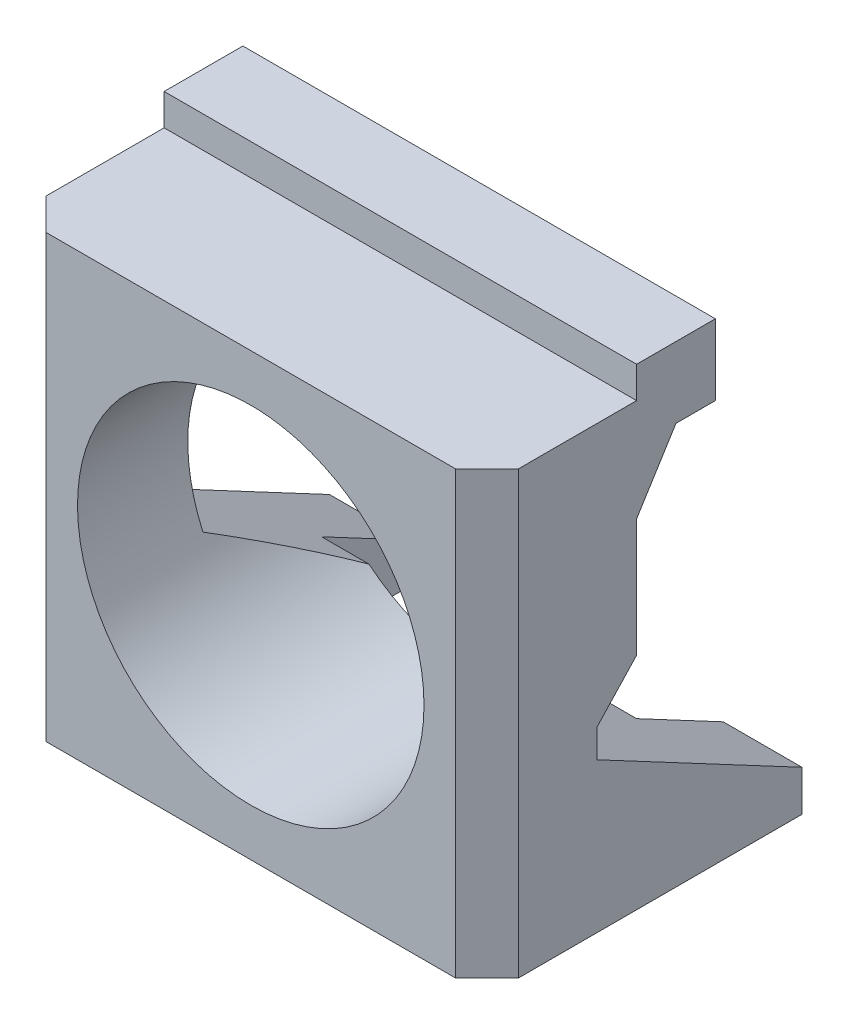
ISO-10303-21;
HEADER;
FILE_DESCRIPTION(('STEP AP214'),'2;1');
FILE_NAME('part.step','',(''),(''),'','','');
FILE_SCHEMA(('AUTOMOTIVE_DESIGN { 1 0 10303 214 1 1 1 1 }'));
ENDSEC;
DATA;
#1=APPLICATION_CONTEXT('core data for automotive mechanical design processes');
#2=APPLICATION_PROTOCOL_DEFINITION('international standard','automotive_design',2000,#1);
#3=PRODUCT_CONTEXT('',#1,'mechanical');
#4=PRODUCT('Part','Part','',(#3));
#5=PRODUCT_RELATED_PRODUCT_CATEGORY('part','',(#4));
#6=PRODUCT_DEFINITION_FORMATION('','',#4);
#7=PRODUCT_DEFINITION_CONTEXT('part definition',#1,'design');
#8=PRODUCT_DEFINITION('design','',#6,#7);
#9=PRODUCT_DEFINITION_SHAPE('','',#8);
#10=(LENGTH_UNIT() NAMED_UNIT(*) SI_UNIT(.MILLI.,.METRE.));
#11=(NAMED_UNIT(*) PLANE_ANGLE_UNIT() SI_UNIT($,.RADIAN.));
#12=(NAMED_UNIT(*) SI_UNIT($,.STERADIAN.) SOLID_ANGLE_UNIT());
#13=UNCERTAINTY_MEASURE_WITH_UNIT(LENGTH_MEASURE(1.E-05),#10,'distance_accuracy_value','');
#14=(GEOMETRIC_REPRESENTATION_CONTEXT(3) GLOBAL_UNCERTAINTY_ASSIGNED_CONTEXT((#13)) GLOBAL_UNIT_ASSIGNED_CONTEXT((#10,
#11,#12)) REPRESENTATION_CONTEXT('',''));
#15=CARTESIAN_POINT('',(0.,0.,0.));
#16=DIRECTION('',(0.,0.,1.));
#17=DIRECTION('',(1.,0.,0.));
#18=AXIS2_PLACEMENT_3D('',#15,#16,#17);
#19=CARTESIAN_POINT('',(0.,0.,-2.5));
#20=DIRECTION('',(0.,0.,1.));
#21=DIRECTION('',(1.,0.,0.));
#22=AXIS2_PLACEMENT_3D('',#19,#20,#21);
#23=PLANE('',#22);
#24=DIRECTION('',(-0.93374611730205,0.357936011632452,0.));
#25=VECTOR('',#24,1.);
#26=CARTESIAN_POINT('',(15.,0.,-2.5));
#27=LINE('',#26,#25);
#28=CARTESIAN_POINT('',(10.8863875755528,1.57688476270478,-2.5));
#29=VERTEX_POINT('',#28);
#30=CARTESIAN_POINT('',(-4.56303568016695,7.49916367739733,-2.5));
#31=VERTEX_POINT('',#30);
#32=EDGE_CURVE('E77',#29,#31,#27,.T.);
#33=ORIENTED_EDGE('',*,*,#32,.T.);
#34=DIRECTION('',(1.,0.,0.));
#35=VECTOR('',#34,1.);
#36=CARTESIAN_POINT('',(15.,7.49916367739733,-2.5));
#37=LINE('',#36,#35);
#38=CARTESIAN_POINT('',(15.,7.49916367739733,-2.5));
#39=VERTEX_POINT('',#38);
#40=EDGE_CURVE('E416',#31,#39,#37,.T.);
#41=ORIENTED_EDGE('',*,*,#40,.T.);
#42=DIRECTION('',(0.,-1.,0.));
#43=VECTOR('',#42,1.);
#44=CARTESIAN_POINT('',(15.,14.,-2.5));
#45=LINE('',#44,#43);
#46=CARTESIAN_POINT('',(15.,0.,-2.5));
#47=VERTEX_POINT('',#46);
#48=EDGE_CURVE('E281',#39,#47,#45,.T.);
#49=ORIENTED_EDGE('',*,*,#48,.T.);
#50=EDGE_CURVE('E283',#47,#29,#27,.T.);
#51=ORIENTED_EDGE('',*,*,#50,.T.);
#52=EDGE_LOOP('',(#33,#41,#49,#51));
#53=FACE_BOUND('',#52,.T.);
#54=ADVANCED_FACE('F61',(#53),#23,.F.);
#55=CARTESIAN_POINT('',(-15.,-11.5,-13.1650852574246));
#56=DIRECTION('',(0.,0.882947592858929,-0.469471562785888));
#57=DIRECTION('',(-1.,0.,0.));
#58=AXIS2_PLACEMENT_3D('',#55,#56,#57);
#59=PLANE('',#58);
#60=DIRECTION('',(-1.,0.,0.));
#61=VECTOR('',#60,1.);
#62=CARTESIAN_POINT('',(-15.,-8.48782073746096,-7.5));
#63=LINE('',#62,#61);
#64=CARTESIAN_POINT('',(6.99692068904083,-8.48782073746097,-7.50000000000001));
#65=VERTEX_POINT('',#64);
#66=CARTESIAN_POINT('',(10.,-8.48782073746097,-7.50000000000001));
#67=VERTEX_POINT('',#66);
#68=EDGE_CURVE('E397',#65,#67,#63,.F.);
#69=ORIENTED_EDGE('',*,*,#68,.F.);
#70=CARTESIAN_POINT('',(0.,0.,8.46326909405839));
#71=DIRECTION('',(0.,0.882947592858929,-0.469471562785888));
#72=DIRECTION('',(0.,-0.469471562785888,-0.882947592858929));
#73=AXIS2_PLACEMENT_3D('',#70,#71,#72);
#74=ELLIPSE('',#73,23.4305991500848,11.);
#75=CARTESIAN_POINT('',(10.0374299499424,-4.49999999999991,0.));
#76=VERTEX_POINT('',#75);
#77=EDGE_CURVE('E408',#76,#65,#74,.T.);
#78=ORIENTED_EDGE('',*,*,#77,.F.);
#79=DIRECTION('',(-1.,0.,0.));
#80=VECTOR('',#79,1.);
#81=CARTESIAN_POINT('',(-15.,-4.49999999999991,0.));
#82=LINE('',#81,#80);
#83=CARTESIAN_POINT('',(15.,-4.4999999999999,0.));
#84=VERTEX_POINT('',#83);
#85=EDGE_CURVE('E387',#84,#76,#82,.T.);
#86=ORIENTED_EDGE('',*,*,#85,.F.);
#87=DIRECTION('',(0.,-0.469471562785888,-0.882947592858929));
#88=VECTOR('',#87,1.);
#89=CARTESIAN_POINT('',(15.,2.47909714683824,13.1257727082817));
#90=LINE('',#89,#88);
#91=CARTESIAN_POINT('',(15.,-11.4122226115991,-13.));
#92=VERTEX_POINT('',#91);
#93=EDGE_CURVE('E406',#92,#84,#90,.F.);
#94=ORIENTED_EDGE('',*,*,#93,.F.);
#95=DIRECTION('',(-1.,0.,0.));
#96=VECTOR('',#95,1.);
#97=CARTESIAN_POINT('',(-15.,-11.4122226115991,-13.));
#98=LINE('',#97,#96);
#99=CARTESIAN_POINT('',(10.,-11.4122226115991,-13.));
#100=VERTEX_POINT('',#99);
#101=EDGE_CURVE('E403',#100,#92,#98,.F.);
#102=ORIENTED_EDGE('',*,*,#101,.F.);
#103=DIRECTION('',(0.,0.469471562785888,0.882947592858929));
#104=VECTOR('',#103,1.);
#105=CARTESIAN_POINT('',(10.,-11.9825779301216,-14.0726823421964));
#106=LINE('',#105,#104);
#107=EDGE_CURVE('E400',#67,#100,#106,.F.);
#108=ORIENTED_EDGE('',*,*,#107,.F.);
#109=EDGE_LOOP('',(#69,#78,#86,#94,#102,#108));
#110=FACE_BOUND('',#109,.T.);
#111=ADVANCED_FACE('F457',(#110),#59,.T.);
#112=CARTESIAN_POINT('',(0.,0.,0.));
#113=DIRECTION('',(0.,0.,1.));
#114=DIRECTION('',(1.,0.,0.));
#115=AXIS2_PLACEMENT_3D('',#112,#113,#114);
#116=PLANE('',#115);
#117=DIRECTION('',(0.,1.,0.));
#118=VECTOR('',#117,1.);
#119=CARTESIAN_POINT('',(15.,14.,0.));
#120=LINE('',#119,#118);
#121=CARTESIAN_POINT('',(15.,-2.67738730440289,0.));
#122=VERTEX_POINT('',#121);
#123=EDGE_CURVE('E322',#84,#122,#120,.T.);
#124=ORIENTED_EDGE('',*,*,#123,.F.);
#125=ORIENTED_EDGE('',*,*,#85,.T.);
#126=CARTESIAN_POINT('',(0.,0.,0.));
#127=DIRECTION('',(0.,0.,1.));
#128=DIRECTION('',(1.,0.,0.));
#129=AXIS2_PLACEMENT_3D('',#126,#127,#128);
#130=CIRCLE('',#129,11.);
#131=CARTESIAN_POINT('',(10.9426223168165,-1.12205919251589,0.));
#132=VERTEX_POINT('',#131);
#133=EDGE_CURVE('E310',#76,#132,#130,.T.);
#134=ORIENTED_EDGE('',*,*,#133,.T.);
#135=DIRECTION('',(0.93374611730205,-0.357936011632452,0.));
#136=VECTOR('',#135,1.);
#137=CARTESIAN_POINT('',(14.1051599709189,-2.33436529325513,0.));
#138=LINE('',#137,#136);
#139=EDGE_CURVE('E371',#132,#122,#138,.T.);
#140=ORIENTED_EDGE('',*,*,#139,.T.);
#141=EDGE_LOOP('',(#124,#125,#134,#140));
#142=FACE_BOUND('',#141,.T.);
#143=ADVANCED_FACE('F463',(#142),#116,.F.);
#144=CARTESIAN_POINT('',(-8.88875672227835,6.47996943913715,0.));
#145=VERTEX_POINT('',#144);
#146=CARTESIAN_POINT('',(-10.0374299499424,-4.49999999999991,0.));
#147=VERTEX_POINT('',#146);
#148=EDGE_CURVE('E326',#145,#147,#130,.T.);
#149=ORIENTED_EDGE('',*,*,#148,.T.);
#150=DIRECTION('',(-1.,0.,0.));
#151=VECTOR('',#150,1.);
#152=CARTESIAN_POINT('',(-15.,-4.49999999999991,0.));
#153=LINE('',#152,#151);
#154=CARTESIAN_POINT('',(-15.,-4.4999999999999,0.));
#155=VERTEX_POINT('',#154);
#156=EDGE_CURVE('E385',#147,#155,#153,.T.);
#157=ORIENTED_EDGE('',*,*,#156,.T.);
#158=DIRECTION('',(0.,-1.,0.));
#159=VECTOR('',#158,1.);
#160=CARTESIAN_POINT('',(-15.,14.,0.));
#161=LINE('',#160,#159);
#162=CARTESIAN_POINT('',(-15.,8.82261269559711,0.));
#163=VERTEX_POINT('',#162);
#164=EDGE_CURVE('E331',#163,#155,#161,.T.);
#165=ORIENTED_EDGE('',*,*,#164,.F.);
#166=DIRECTION('',(0.93374611730205,-0.357936011632452,0.));
#167=VECTOR('',#166,1.);
#168=CARTESIAN_POINT('',(-7.93768195193348,6.11539077717161,0.));
#169=LINE('',#168,#167);
#170=EDGE_CURVE('E369',#163,#145,#169,.T.);
#171=ORIENTED_EDGE('',*,*,#170,.T.);
#172=EDGE_LOOP('',(#149,#157,#165,#171));
#173=FACE_BOUND('',#172,.T.);
#174=ADVANCED_FACE('F527',(#173),#116,.F.);
#175=CARTESIAN_POINT('',(0.,0.,7.));
#176=DIRECTION('',(0.,0.,1.));
#177=DIRECTION('',(1.,0.,0.));
#178=AXIS2_PLACEMENT_3D('',#175,#176,#177);
#179=PLANE('',#178);
#180=DIRECTION('',(-1.,0.,0.));
#181=VECTOR('',#180,1.);
#182=CARTESIAN_POINT('',(-15.,14.,7.));
#183=LINE('',#182,#181);
#184=CARTESIAN_POINT('',(13.,14.,7.));
#185=VERTEX_POINT('',#184);
#186=CARTESIAN_POINT('',(-13.,14.,7.));
#187=VERTEX_POINT('',#186);
#188=EDGE_CURVE('E327',#185,#187,#183,.T.);
#189=ORIENTED_EDGE('',*,*,#188,.T.);
#190=DIRECTION('',(0.,-1.,0.));
#191=VECTOR('',#190,1.);
#192=CARTESIAN_POINT('',(-13.,-14.,7.));
#193=LINE('',#192,#191);
#194=CARTESIAN_POINT('',(-13.,-14.,7.));
#195=VERTEX_POINT('',#194);
#196=EDGE_CURVE('E355',#187,#195,#193,.T.);
#197=ORIENTED_EDGE('',*,*,#196,.T.);
#198=DIRECTION('',(1.,0.,0.));
#199=VECTOR('',#198,1.);
#200=CARTESIAN_POINT('',(-15.,-14.,7.));
#201=LINE('',#200,#199);
#202=CARTESIAN_POINT('',(13.,-14.,7.));
#203=VERTEX_POINT('',#202);
#204=EDGE_CURVE('E330',#195,#203,#201,.T.);
#205=ORIENTED_EDGE('',*,*,#204,.T.);
#206=DIRECTION('',(0.,1.,0.));
#207=VECTOR('',#206,1.);
#208=CARTESIAN_POINT('',(13.,14.,7.));
#209=LINE('',#208,#207);
#210=EDGE_CURVE('E345',#203,#185,#209,.T.);
#211=ORIENTED_EDGE('',*,*,#210,.T.);
#212=EDGE_LOOP('',(#189,#197,#205,#211));
#213=FACE_BOUND('',#212,.T.);
#214=CARTESIAN_POINT('',(0.,0.,7.));
#215=DIRECTION('',(0.,0.,1.));
#216=DIRECTION('',(1.,0.,0.));
#217=AXIS2_PLACEMENT_3D('',#214,#215,#216);
#218=CIRCLE('',#217,11.);
#219=CARTESIAN_POINT('',(11.,0.,7.));
#220=VERTEX_POINT('',#219);
#221=EDGE_CURVE('E319',#220,#220,#218,.T.);
#222=ORIENTED_EDGE('',*,*,#221,.F.);
#223=EDGE_LOOP('',(#222));
#224=FACE_BOUND('',#223,.T.);
#225=ADVANCED_FACE('F544',(#213,#224),#179,.T.);
#226=CARTESIAN_POINT('',(15.,14.,7.));
#227=DIRECTION('',(-1.,0.,0.));
#228=DIRECTION('',(0.,-1.,0.));
#229=AXIS2_PLACEMENT_3D('',#226,#227,#228);
#230=PLANE('',#229);
#231=DIRECTION('',(0.,0.,-1.));
#232=VECTOR('',#231,1.);
#233=CARTESIAN_POINT('',(15.,14.,7.));
#234=LINE('',#233,#232);
#235=CARTESIAN_POINT('',(15.,14.,5.));
#236=VERTEX_POINT('',#235);
#237=CARTESIAN_POINT('',(15.,14.,-2.5));
#238=VERTEX_POINT('',#237);
#239=EDGE_CURVE('E343',#236,#238,#234,.T.);
#240=ORIENTED_EDGE('',*,*,#239,.F.);
#241=DIRECTION('',(0.,-1.,0.));
#242=VECTOR('',#241,1.);
#243=CARTESIAN_POINT('',(15.,-14.,5.));
#244=LINE('',#243,#242);
#245=CARTESIAN_POINT('',(15.,-14.,5.));
#246=VERTEX_POINT('',#245);
#247=EDGE_CURVE('E350',#236,#246,#244,.T.);
#248=ORIENTED_EDGE('',*,*,#247,.T.);
#249=DIRECTION('',(0.,0.,-1.));
#250=VECTOR('',#249,1.);
#251=CARTESIAN_POINT('',(15.,-14.,7.));
#252=LINE('',#251,#250);
#253=CARTESIAN_POINT('',(15.,-14.,-13.));
#254=VERTEX_POINT('',#253);
#255=EDGE_CURVE('E333',#246,#254,#252,.T.);
#256=ORIENTED_EDGE('',*,*,#255,.T.);
#257=DIRECTION('',(0.,1.,0.));
#258=VECTOR('',#257,1.);
#259=CARTESIAN_POINT('',(15.,-14.,-13.));
#260=LINE('',#259,#258);
#261=EDGE_CURVE('E313',#254,#92,#260,.T.);
#262=ORIENTED_EDGE('',*,*,#261,.T.);
#263=ORIENTED_EDGE('',*,*,#93,.T.);
#264=ORIENTED_EDGE('',*,*,#123,.T.);
#265=DIRECTION('',(0.,-0.730904755898013,0.682479477937371));
#266=VECTOR('',#265,1.);
#267=CARTESIAN_POINT('',(15.,2.7402434565621,-5.05869168802721));
#268=LINE('',#267,#266);
#269=EDGE_CURVE('E377',#122,#47,#268,.F.);
#270=ORIENTED_EDGE('',*,*,#269,.T.);
#271=ORIENTED_EDGE('',*,*,#48,.F.);
#272=DIRECTION('',(0.,-0.848048096156429,0.5299192642332));
#273=VECTOR('',#272,1.);
#274=CARTESIAN_POINT('',(15.,7.90519965569138,-2.75371943860847));
#275=LINE('',#274,#273);
#276=CARTESIAN_POINT('',(15.,11.5,-5.));
#277=VERTEX_POINT('',#276);
#278=EDGE_CURVE('E233',#39,#277,#275,.F.);
#279=ORIENTED_EDGE('',*,*,#278,.T.);
#280=DIRECTION('',(0.,0.,-1.));
#281=VECTOR('',#280,1.);
#282=CARTESIAN_POINT('',(15.,11.5,-2.5));
#283=LINE('',#282,#281);
#284=CARTESIAN_POINT('',(15.,11.5,-7.5));
#285=VERTEX_POINT('',#284);
#286=EDGE_CURVE('E225',#277,#285,#283,.T.);
#287=ORIENTED_EDGE('',*,*,#286,.T.);
#288=DIRECTION('',(0.,-1.,0.));
#289=VECTOR('',#288,1.);
#290=CARTESIAN_POINT('',(15.,46.4138126514911,-7.5));
#291=LINE('',#290,#289);
#292=CARTESIAN_POINT('',(15.,16.,-7.5));
#293=VERTEX_POINT('',#292);
#294=EDGE_CURVE('E230',#293,#285,#291,.T.);
#295=ORIENTED_EDGE('',*,*,#294,.F.);
#296=DIRECTION('',(0.,0.,1.));
#297=VECTOR('',#296,1.);
#298=CARTESIAN_POINT('',(15.,16.,-2.5));
#299=LINE('',#298,#297);
#300=CARTESIAN_POINT('',(15.,16.,-2.50000000000001));
#301=VERTEX_POINT('',#300);
#302=EDGE_CURVE('E262',#293,#301,#299,.T.);
#303=ORIENTED_EDGE('',*,*,#302,.T.);
#304=DIRECTION('',(0.,-1.,0.));
#305=VECTOR('',#304,1.);
#306=CARTESIAN_POINT('',(15.,46.4138126514911,-2.5));
#307=LINE('',#306,#305);
#308=EDGE_CURVE('E247',#301,#238,#307,.T.);
#309=ORIENTED_EDGE('',*,*,#308,.T.);
#310=EDGE_LOOP('',(#240,#248,#256,#262,#263,#264,#270,#271,#279,#287,#295,#303,#309));
#311=FACE_BOUND('',#310,.T.);
#312=ADVANCED_FACE('F228',(#311),#230,.F.);
#313=CARTESIAN_POINT('',(-15.,14.,7.));
#314=DIRECTION('',(0.,-1.,0.));
#315=DIRECTION('',(0.,0.,-1.));
#316=AXIS2_PLACEMENT_3D('',#313,#314,#315);
#317=PLANE('',#316);
#318=DIRECTION('',(0.,0.,-1.));
#319=VECTOR('',#318,1.);
#320=CARTESIAN_POINT('',(-15.,14.,7.));
#321=LINE('',#320,#319);
#322=CARTESIAN_POINT('',(-15.,14.,4.99999999999998));
#323=VERTEX_POINT('',#322);
#324=CARTESIAN_POINT('',(-15.,14.,-2.5));
#325=VERTEX_POINT('',#324);
#326=EDGE_CURVE('E340',#323,#325,#321,.T.);
#327=ORIENTED_EDGE('',*,*,#326,.F.);
#328=DIRECTION('',(0.707106781186546,0.,0.707106781186549));
#329=VECTOR('',#328,1.);
#330=CARTESIAN_POINT('',(-13.,14.,7.));
#331=LINE('',#330,#329);
#332=EDGE_CURVE('E362',#323,#187,#331,.T.);
#333=ORIENTED_EDGE('',*,*,#332,.T.);
#334=ORIENTED_EDGE('',*,*,#188,.F.);
#335=DIRECTION('',(0.707106781186546,0.,-0.707106781186549));
#336=VECTOR('',#335,1.);
#337=CARTESIAN_POINT('',(13.,14.,7.));
#338=LINE('',#337,#336);
#339=EDGE_CURVE('E348',#185,#236,#338,.T.);
#340=ORIENTED_EDGE('',*,*,#339,.T.);
#341=ORIENTED_EDGE('',*,*,#239,.T.);
#342=DIRECTION('',(1.,0.,0.));
#343=VECTOR('',#342,1.);
#344=CARTESIAN_POINT('',(-15.,14.,-2.5));
#345=LINE('',#344,#343);
#346=EDGE_CURVE('E285',#325,#238,#345,.T.);
#347=ORIENTED_EDGE('',*,*,#346,.F.);
#348=EDGE_LOOP('',(#327,#333,#334,#340,#341,#347));
#349=FACE_BOUND('',#348,.T.);
#350=ADVANCED_FACE('F547',(#349),#317,.F.);
#351=CARTESIAN_POINT('',(-15.,14.,7.));
#352=DIRECTION('',(1.,0.,0.));
#353=DIRECTION('',(0.,1.,0.));
#354=AXIS2_PLACEMENT_3D('',#351,#352,#353);
#355=PLANE('',#354);
#356=DIRECTION('',(0.,0.,-1.));
#357=VECTOR('',#356,1.);
#358=CARTESIAN_POINT('',(-15.,-14.,7.));
#359=LINE('',#358,#357);
#360=CARTESIAN_POINT('',(-15.,-14.,4.99999999999998));
#361=VERTEX_POINT('',#360);
#362=CARTESIAN_POINT('',(-15.,-14.,-13.));
#363=VERTEX_POINT('',#362);
#364=EDGE_CURVE('E338',#361,#363,#359,.T.);
#365=ORIENTED_EDGE('',*,*,#364,.F.);
#366=DIRECTION('',(0.,1.,0.));
#367=VECTOR('',#366,1.);
#368=CARTESIAN_POINT('',(-15.,14.,4.99999999999998));
#369=LINE('',#368,#367);
#370=EDGE_CURVE('E360',#361,#323,#369,.T.);
#371=ORIENTED_EDGE('',*,*,#370,.T.);
#372=ORIENTED_EDGE('',*,*,#326,.T.);
#373=DIRECTION('',(0.,-1.,0.));
#374=VECTOR('',#373,1.);
#375=CARTESIAN_POINT('',(-15.,46.4138126514911,-2.5));
#376=LINE('',#375,#374);
#377=CARTESIAN_POINT('',(-15.,16.,-2.5));
#378=VERTEX_POINT('',#377);
#379=EDGE_CURVE('E258',#378,#325,#376,.T.);
#380=ORIENTED_EDGE('',*,*,#379,.F.);
#381=DIRECTION('',(0.,0.,-1.));
#382=VECTOR('',#381,1.);
#383=CARTESIAN_POINT('',(-15.,16.,-7.5));
#384=LINE('',#383,#382);
#385=CARTESIAN_POINT('',(-15.,16.,-7.5));
#386=VERTEX_POINT('',#385);
#387=EDGE_CURVE('E267',#378,#386,#384,.T.);
#388=ORIENTED_EDGE('',*,*,#387,.T.);
#389=DIRECTION('',(0.,-1.,0.));
#390=VECTOR('',#389,1.);
#391=CARTESIAN_POINT('',(-15.,46.4138126514911,-7.5));
#392=LINE('',#391,#390);
#393=CARTESIAN_POINT('',(-15.,11.5,-7.5));
#394=VERTEX_POINT('',#393);
#395=EDGE_CURVE('E248',#386,#394,#392,.T.);
#396=ORIENTED_EDGE('',*,*,#395,.T.);
#397=DIRECTION('',(0.,0.,1.));
#398=VECTOR('',#397,1.);
#399=CARTESIAN_POINT('',(-15.,11.5,-7.5));
#400=LINE('',#399,#398);
#401=CARTESIAN_POINT('',(-15.,11.5,-2.5));
#402=VERTEX_POINT('',#401);
#403=EDGE_CURVE('E238',#394,#402,#400,.T.);
#404=ORIENTED_EDGE('',*,*,#403,.T.);
#405=DIRECTION('',(0.,0.730904755898013,-0.682479477937371));
#406=VECTOR('',#405,1.);
#407=CARTESIAN_POINT('',(-15.,8.09669319132727,0.677824518585793));
#408=LINE('',#407,#406);
#409=EDGE_CURVE('E380',#402,#163,#408,.F.);
#410=ORIENTED_EDGE('',*,*,#409,.T.);
#411=ORIENTED_EDGE('',*,*,#164,.T.);
#412=DIRECTION('',(0.,0.469471562785888,0.882947592858929));
#413=VECTOR('',#412,1.);
#414=CARTESIAN_POINT('',(-15.,2.47909714683824,13.1257727082817));
#415=LINE('',#414,#413);
#416=CARTESIAN_POINT('',(-15.,-11.4122226115991,-13.));
#417=VERTEX_POINT('',#416);
#418=EDGE_CURVE('E411',#155,#417,#415,.F.);
#419=ORIENTED_EDGE('',*,*,#418,.T.);
#420=DIRECTION('',(0.,1.,0.));
#421=VECTOR('',#420,1.);
#422=CARTESIAN_POINT('',(-15.,-14.,-13.));
#423=LINE('',#422,#421);
#424=EDGE_CURVE('E299',#363,#417,#423,.T.);
#425=ORIENTED_EDGE('',*,*,#424,.F.);
#426=EDGE_LOOP('',(#365,#371,#372,#380,#388,#396,#404,#410,#411,#419,#425));
#427=FACE_BOUND('',#426,.T.);
#428=ADVANCED_FACE('F501',(#427),#355,.F.);
#429=CARTESIAN_POINT('',(-15.,-14.,7.));
#430=DIRECTION('',(0.,1.,0.));
#431=DIRECTION('',(0.,0.,1.));
#432=AXIS2_PLACEMENT_3D('',#429,#430,#431);
#433=PLANE('',#432);
#434=CARTESIAN_POINT('',(-10.9999999999997,-14.,2.49999999999995));
#435=DIRECTION('',(0.,-1.,0.));
#436=DIRECTION('',(0.,0.,-1.));
#437=AXIS2_PLACEMENT_3D('',#434,#435,#436);
#438=CIRCLE('',#437,1.5);
#439=CARTESIAN_POINT('',(-10.9999999999997,-14.,0.999999999999946));
#440=VERTEX_POINT('',#439);
#441=EDGE_CURVE('E272',#440,#440,#438,.T.);
#442=ORIENTED_EDGE('',*,*,#441,.F.);
#443=EDGE_LOOP('',(#442));
#444=FACE_BOUND('',#443,.T.);
#445=CARTESIAN_POINT('',(11.0000000000002,-14.,2.49999999999995));
#446=DIRECTION('',(0.,-1.,0.));
#447=DIRECTION('',(0.,0.,-1.));
#448=AXIS2_PLACEMENT_3D('',#445,#446,#447);
#449=CIRCLE('',#448,1.5);
#450=CARTESIAN_POINT('',(11.0000000000002,-14.,0.999999999999953));
#451=VERTEX_POINT('',#450);
#452=EDGE_CURVE('E275',#451,#451,#449,.T.);
#453=ORIENTED_EDGE('',*,*,#452,.F.);
#454=EDGE_LOOP('',(#453));
#455=FACE_BOUND('',#454,.T.);
#456=ORIENTED_EDGE('',*,*,#204,.F.);
#457=DIRECTION('',(-0.707106781186546,0.,-0.707106781186549));
#458=VECTOR('',#457,1.);
#459=CARTESIAN_POINT('',(-13.,-14.,7.));
#460=LINE('',#459,#458);
#461=EDGE_CURVE('E358',#195,#361,#460,.T.);
#462=ORIENTED_EDGE('',*,*,#461,.T.);
#463=ORIENTED_EDGE('',*,*,#364,.T.);
#464=DIRECTION('',(1.,0.,0.));
#465=VECTOR('',#464,1.);
#466=CARTESIAN_POINT('',(-15.,-14.,-13.));
#467=LINE('',#466,#465);
#468=CARTESIAN_POINT('',(-10.,-14.,-13.));
#469=VERTEX_POINT('',#468);
#470=EDGE_CURVE('E304',#363,#469,#467,.T.);
#471=ORIENTED_EDGE('',*,*,#470,.T.);
#472=DIRECTION('',(0.,0.,1.));
#473=VECTOR('',#472,1.);
#474=CARTESIAN_POINT('',(-10.,-14.,-13.));
#475=LINE('',#474,#473);
#476=CARTESIAN_POINT('',(-10.,-14.,-7.50000000000001));
#477=VERTEX_POINT('',#476);
#478=EDGE_CURVE('E307',#469,#477,#475,.T.);
#479=ORIENTED_EDGE('',*,*,#478,.T.);
#480=DIRECTION('',(1.,0.,0.));
#481=VECTOR('',#480,1.);
#482=CARTESIAN_POINT('',(0.,-14.,-7.50000000000001));
#483=LINE('',#482,#481);
#484=CARTESIAN_POINT('',(10.,-14.,-7.50000000000001));
#485=VERTEX_POINT('',#484);
#486=EDGE_CURVE('E288',#477,#485,#483,.T.);
#487=ORIENTED_EDGE('',*,*,#486,.T.);
#488=DIRECTION('',(0.,0.,1.));
#489=VECTOR('',#488,1.);
#490=CARTESIAN_POINT('',(10.,-14.,-13.));
#491=LINE('',#490,#489);
#492=CARTESIAN_POINT('',(10.,-14.,-13.));
#493=VERTEX_POINT('',#492);
#494=EDGE_CURVE('E298',#493,#485,#491,.T.);
#495=ORIENTED_EDGE('',*,*,#494,.F.);
#496=DIRECTION('',(-1.,0.,0.));
#497=VECTOR('',#496,1.);
#498=CARTESIAN_POINT('',(15.,-14.,-13.));
#499=LINE('',#498,#497);
#500=EDGE_CURVE('E302',#254,#493,#499,.T.);
#501=ORIENTED_EDGE('',*,*,#500,.F.);
#502=ORIENTED_EDGE('',*,*,#255,.F.);
#503=DIRECTION('',(-0.707106781186546,0.,0.707106781186549));
#504=VECTOR('',#503,1.);
#505=CARTESIAN_POINT('',(13.,-14.,7.));
#506=LINE('',#505,#504);
#507=EDGE_CURVE('E352',#246,#203,#506,.T.);
#508=ORIENTED_EDGE('',*,*,#507,.T.);
#509=EDGE_LOOP('',(#456,#462,#463,#471,#479,#487,#495,#501,#502,#508));
#510=FACE_BOUND('',#509,.T.);
#511=ADVANCED_FACE('F511',(#444,#455,#510),#433,.F.);
#512=CARTESIAN_POINT('',(0.,0.,7.));
#513=DIRECTION('',(0.,0.,-1.));
#514=DIRECTION('',(-1.,0.,0.));
#515=AXIS2_PLACEMENT_3D('',#512,#513,#514);
#516=CYLINDRICAL_SURFACE('',#515,11.);
#517=ORIENTED_EDGE('',*,*,#221,.T.);
#518=EDGE_LOOP('',(#517));
#519=FACE_BOUND('',#518,.T.);
#520=ORIENTED_EDGE('',*,*,#77,.T.);
#521=CARTESIAN_POINT('',(0.,0.,-7.50000000000001));
#522=DIRECTION('',(0.,0.,-1.));
#523=DIRECTION('',(-1.,0.,0.));
#524=AXIS2_PLACEMENT_3D('',#521,#522,#523);
#525=CIRCLE('',#524,11.);
#526=CARTESIAN_POINT('',(-6.99692068904083,-8.48782073746096,-7.50000000000001));
#527=VERTEX_POINT('',#526);
#528=EDGE_CURVE('E414',#65,#527,#525,.T.);
#529=ORIENTED_EDGE('',*,*,#528,.T.);
#530=EDGE_CURVE('E409',#527,#147,#74,.T.);
#531=ORIENTED_EDGE('',*,*,#530,.T.);
#532=ORIENTED_EDGE('',*,*,#148,.F.);
#533=CARTESIAN_POINT('',(0.,0.,2.86904017448678));
#534=DIRECTION('',(-0.253098981056174,-0.660258211450888,-0.707106781186548));
#535=DIRECTION('',(0.253098981056174,0.660258211450889,-0.707106781186547));
#536=AXIS2_PLACEMENT_3D('',#533,#534,#535);
#537=ELLIPSE('',#536,15.556349186104,11.);
#538=CARTESIAN_POINT('',(-7.04284192285235,8.44975607042674,-2.5));
#539=VERTEX_POINT('',#538);
#540=EDGE_CURVE('E382',#145,#539,#537,.T.);
#541=ORIENTED_EDGE('',*,*,#540,.T.);
#542=DIRECTION('',(0.,0.,-1.));
#543=VECTOR('',#542,1.);
#544=CARTESIAN_POINT('',(-7.04284192285235,8.44975607042674,0.));
#545=LINE('',#544,#543);
#546=CARTESIAN_POINT('',(-7.04284192285235,8.44975607042674,0.));
#547=VERTEX_POINT('',#546);
#548=EDGE_CURVE('E364',#547,#539,#545,.T.);
#549=ORIENTED_EDGE('',*,*,#548,.F.);
#550=CARTESIAN_POINT('',(10.8863875755528,1.57688476270478,0.));
#551=VERTEX_POINT('',#550);
#552=EDGE_CURVE('E323',#551,#547,#130,.T.);
#553=ORIENTED_EDGE('',*,*,#552,.F.);
#554=DIRECTION('',(0.,0.,-1.));
#555=VECTOR('',#554,1.);
#556=CARTESIAN_POINT('',(10.8863875755528,1.57688476270477,-2.5));
#557=LINE('',#556,#555);
#558=EDGE_CURVE('E367',#29,#551,#557,.F.);
#559=ORIENTED_EDGE('',*,*,#558,.F.);
#560=CARTESIAN_POINT('',(0.,0.,2.86904017448678));
#561=DIRECTION('',(-0.253098981056174,-0.660258211450888,-0.707106781186548));
#562=DIRECTION('',(0.253098981056174,0.660258211450889,-0.707106781186547));
#563=AXIS2_PLACEMENT_3D('',#560,#561,#562);
#564=ELLIPSE('',#563,15.556349186104,11.);
#565=EDGE_CURVE('E374',#29,#132,#564,.T.);
#566=ORIENTED_EDGE('',*,*,#565,.T.);
#567=ORIENTED_EDGE('',*,*,#133,.F.);
#568=EDGE_LOOP('',(#520,#529,#531,#532,#541,#549,#553,#559,#566,#567));
#569=FACE_BOUND('',#568,.T.);
#570=ADVANCED_FACE('F439',(#519,#569),#516,.F.);
#571=CARTESIAN_POINT('',(10.,-14.,-13.));
#572=DIRECTION('',(1.,0.,0.));
#573=DIRECTION('',(0.,0.,-1.));
#574=AXIS2_PLACEMENT_3D('',#571,#572,#573);
#575=PLANE('',#574);
#576=ORIENTED_EDGE('',*,*,#494,.T.);
#577=DIRECTION('',(0.,-1.,0.));
#578=VECTOR('',#577,1.);
#579=CARTESIAN_POINT('',(10.,9.86000936329383,-7.50000000000001));
#580=LINE('',#579,#578);
#581=EDGE_CURVE('E293',#67,#485,#580,.T.);
#582=ORIENTED_EDGE('',*,*,#581,.F.);
#583=ORIENTED_EDGE('',*,*,#107,.T.);
#584=DIRECTION('',(0.,1.,0.));
#585=VECTOR('',#584,1.);
#586=CARTESIAN_POINT('',(10.,-14.,-13.));
#587=LINE('',#586,#585);
#588=EDGE_CURVE('E315',#493,#100,#587,.T.);
#589=ORIENTED_EDGE('',*,*,#588,.F.);
#590=EDGE_LOOP('',(#576,#582,#583,#589));
#591=FACE_BOUND('',#590,.T.);
#592=ADVANCED_FACE('F706',(#591),#575,.F.);
#593=CARTESIAN_POINT('',(0.,0.,-13.));
#594=DIRECTION('',(0.,0.,-1.));
#595=DIRECTION('',(-1.,0.,0.));
#596=AXIS2_PLACEMENT_3D('',#593,#594,#595);
#597=PLANE('',#596);
#598=ORIENTED_EDGE('',*,*,#500,.T.);
#599=ORIENTED_EDGE('',*,*,#588,.T.);
#600=ORIENTED_EDGE('',*,*,#101,.T.);
#601=ORIENTED_EDGE('',*,*,#261,.F.);
#602=EDGE_LOOP('',(#598,#599,#600,#601));
#603=FACE_BOUND('',#602,.T.);
#604=ADVANCED_FACE('F518',(#603),#597,.T.);
#605=CARTESIAN_POINT('',(-10.,-14.,-13.));
#606=DIRECTION('',(1.,0.,0.));
#607=DIRECTION('',(0.,0.,-1.));
#608=AXIS2_PLACEMENT_3D('',#605,#606,#607);
#609=PLANE('',#608);
#610=DIRECTION('',(0.,-1.,0.));
#611=VECTOR('',#610,1.);
#612=CARTESIAN_POINT('',(-10.,9.86000936329383,-7.50000000000001));
#613=LINE('',#612,#611);
#614=CARTESIAN_POINT('',(-10.,-8.48782073746097,-7.50000000000001));
#615=VERTEX_POINT('',#614);
#616=EDGE_CURVE('E295',#615,#477,#613,.T.);
#617=ORIENTED_EDGE('',*,*,#616,.T.);
#618=ORIENTED_EDGE('',*,*,#478,.F.);
#619=DIRECTION('',(0.,1.,0.));
#620=VECTOR('',#619,1.);
#621=CARTESIAN_POINT('',(-10.,-14.,-13.));
#622=LINE('',#621,#620);
#623=CARTESIAN_POINT('',(-10.,-11.4122226115991,-13.));
#624=VERTEX_POINT('',#623);
#625=EDGE_CURVE('E301',#469,#624,#622,.T.);
#626=ORIENTED_EDGE('',*,*,#625,.T.);
#627=DIRECTION('',(0.,-0.469471562785888,-0.882947592858929));
#628=VECTOR('',#627,1.);
#629=CARTESIAN_POINT('',(-10.,-11.5,-13.1650852574246));
#630=LINE('',#629,#628);
#631=EDGE_CURVE('E393',#624,#615,#630,.F.);
#632=ORIENTED_EDGE('',*,*,#631,.T.);
#633=EDGE_LOOP('',(#617,#618,#626,#632));
#634=FACE_BOUND('',#633,.T.);
#635=ADVANCED_FACE('F724',(#634),#609,.T.);
#636=CARTESIAN_POINT('',(0.,0.,-13.));
#637=DIRECTION('',(0.,0.,-1.));
#638=DIRECTION('',(-1.,0.,0.));
#639=AXIS2_PLACEMENT_3D('',#636,#637,#638);
#640=PLANE('',#639);
#641=ORIENTED_EDGE('',*,*,#424,.T.);
#642=DIRECTION('',(-1.,0.,0.));
#643=VECTOR('',#642,1.);
#644=CARTESIAN_POINT('',(-15.,-11.4122226115991,-13.));
#645=LINE('',#644,#643);
#646=EDGE_CURVE('E390',#417,#624,#645,.F.);
#647=ORIENTED_EDGE('',*,*,#646,.T.);
#648=ORIENTED_EDGE('',*,*,#625,.F.);
#649=ORIENTED_EDGE('',*,*,#470,.F.);
#650=EDGE_LOOP('',(#641,#647,#648,#649));
#651=FACE_BOUND('',#650,.T.);
#652=ADVANCED_FACE('F540',(#651),#640,.T.);
#653=CARTESIAN_POINT('',(0.,9.86000936329383,-7.50000000000001));
#654=DIRECTION('',(0.,0.,-1.));
#655=DIRECTION('',(-1.,0.,0.));
#656=AXIS2_PLACEMENT_3D('',#653,#654,#655);
#657=PLANE('',#656);
#658=ORIENTED_EDGE('',*,*,#528,.F.);
#659=ORIENTED_EDGE('',*,*,#68,.T.);
#660=ORIENTED_EDGE('',*,*,#581,.T.);
#661=ORIENTED_EDGE('',*,*,#486,.F.);
#662=ORIENTED_EDGE('',*,*,#616,.F.);
#663=EDGE_CURVE('E396',#615,#527,#63,.F.);
#664=ORIENTED_EDGE('',*,*,#663,.T.);
#665=EDGE_LOOP('',(#658,#659,#660,#661,#662,#664));
#666=FACE_BOUND('',#665,.T.);
#667=ADVANCED_FACE('F562',(#666),#657,.T.);
#668=CARTESIAN_POINT('',(13.,0.,7.));
#669=DIRECTION('',(0.707106781186549,0.,0.707106781186546));
#670=DIRECTION('',(0.,-1.,0.));
#671=AXIS2_PLACEMENT_3D('',#668,#669,#670);
#672=PLANE('',#671);
#673=ORIENTED_EDGE('',*,*,#507,.F.);
#674=ORIENTED_EDGE('',*,*,#247,.F.);
#675=ORIENTED_EDGE('',*,*,#339,.F.);
#676=ORIENTED_EDGE('',*,*,#210,.F.);
#677=EDGE_LOOP('',(#673,#674,#675,#676));
#678=FACE_BOUND('',#677,.T.);
#679=ADVANCED_FACE('F452',(#678),#672,.T.);
#680=CARTESIAN_POINT('',(-13.,0.,7.));
#681=DIRECTION('',(-0.707106781186549,0.,0.707106781186546));
#682=DIRECTION('',(0.,1.,0.));
#683=AXIS2_PLACEMENT_3D('',#680,#681,#682);
#684=PLANE('',#683);
#685=ORIENTED_EDGE('',*,*,#332,.F.);
#686=ORIENTED_EDGE('',*,*,#370,.F.);
#687=ORIENTED_EDGE('',*,*,#461,.F.);
#688=ORIENTED_EDGE('',*,*,#196,.F.);
#689=EDGE_LOOP('',(#685,#686,#687,#688));
#690=FACE_BOUND('',#689,.T.);
#691=ADVANCED_FACE('F444',(#690),#684,.T.);
#692=CARTESIAN_POINT('',(0.,0.,0.));
#693=DIRECTION('',(0.,0.,1.));
#694=DIRECTION('',(1.,0.,0.));
#695=AXIS2_PLACEMENT_3D('',#692,#693,#694);
#696=PLANE('',#695);
#697=DIRECTION('',(-0.93374611730205,0.357936011632452,0.));
#698=VECTOR('',#697,1.);
#699=CARTESIAN_POINT('',(15.,0.,0.));
#700=LINE('',#699,#698);
#701=EDGE_CURVE('E271',#551,#547,#700,.T.);
#702=ORIENTED_EDGE('',*,*,#701,.F.);
#703=ORIENTED_EDGE('',*,*,#552,.T.);
#704=EDGE_LOOP('',(#702,#703));
#705=FACE_BOUND('',#704,.T.);
#706=ADVANCED_FACE('F442',(#705),#696,.T.);
#707=CARTESIAN_POINT('',(15.,0.,-2.5));
#708=DIRECTION('',(0.357936011632452,0.93374611730205,0.));
#709=DIRECTION('',(-0.93374611730205,0.357936011632452,0.));
#710=AXIS2_PLACEMENT_3D('',#707,#708,#709);
#711=PLANE('',#710);
#712=ORIENTED_EDGE('',*,*,#32,.F.);
#713=ORIENTED_EDGE('',*,*,#558,.T.);
#714=ORIENTED_EDGE('',*,*,#701,.T.);
#715=ORIENTED_EDGE('',*,*,#548,.T.);
#716=DIRECTION('',(-0.93374611730205,0.357936011632452,0.));
#717=VECTOR('',#716,1.);
#718=CARTESIAN_POINT('',(15.,0.,-2.5));
#719=LINE('',#718,#717);
#720=EDGE_CURVE('E12',#539,#31,#719,.F.);
#721=ORIENTED_EDGE('',*,*,#720,.T.);
#722=EDGE_LOOP('',(#712,#713,#714,#715,#721));
#723=FACE_BOUND('',#722,.T.);
#724=ADVANCED_FACE('F427',(#723),#711,.F.);
#725=CARTESIAN_POINT('',(15.,0.,-2.5));
#726=DIRECTION('',(-0.253098981056174,-0.660258211450888,-0.707106781186548));
#727=DIRECTION('',(0.93374611730205,-0.357936011632452,0.));
#728=AXIS2_PLACEMENT_3D('',#725,#726,#727);
#729=PLANE('',#728);
#730=ORIENTED_EDGE('',*,*,#269,.F.);
#731=ORIENTED_EDGE('',*,*,#139,.F.);
#732=ORIENTED_EDGE('',*,*,#565,.F.);
#733=ORIENTED_EDGE('',*,*,#50,.F.);
#734=EDGE_LOOP('',(#730,#731,#732,#733));
#735=FACE_BOUND('',#734,.T.);
#736=ADVANCED_FACE('F433',(#735),#729,.T.);
#737=CARTESIAN_POINT('',(15.,0.,-2.5));
#738=DIRECTION('',(-0.253098981056174,-0.660258211450888,-0.707106781186548));
#739=DIRECTION('',(0.93374611730205,-0.357936011632452,0.));
#740=AXIS2_PLACEMENT_3D('',#737,#738,#739);
#741=PLANE('',#740);
#742=ORIENTED_EDGE('',*,*,#540,.F.);
#743=ORIENTED_EDGE('',*,*,#170,.F.);
#744=ORIENTED_EDGE('',*,*,#409,.F.);
#745=DIRECTION('',(0.941505148706469,0.,-0.336998597859412));
#746=VECTOR('',#745,1.);
#747=CARTESIAN_POINT('',(11.5929583512237,11.5,-12.0185774497449));
#748=LINE('',#747,#746);
#749=CARTESIAN_POINT('',(-8.01551137981852,11.5,-5.));
#750=VERTEX_POINT('',#749);
#751=EDGE_CURVE('E84',#750,#402,#748,.F.);
#752=ORIENTED_EDGE('',*,*,#751,.F.);
#753=DIRECTION('',(0.590565724475005,-0.684365946906504,0.427639305712275));
#754=VECTOR('',#753,1.);
#755=CARTESIAN_POINT('',(5.29080772467555,-3.91977682819724,4.63534595322196));
#756=LINE('',#755,#754);
#757=EDGE_CURVE('E70',#750,#31,#756,.T.);
#758=ORIENTED_EDGE('',*,*,#757,.T.);
#759=ORIENTED_EDGE('',*,*,#720,.F.);
#760=EDGE_LOOP('',(#742,#743,#744,#752,#758,#759));
#761=FACE_BOUND('',#760,.T.);
#762=ADVANCED_FACE('F423',(#761),#741,.T.);
#763=ORIENTED_EDGE('',*,*,#530,.F.);
#764=ORIENTED_EDGE('',*,*,#663,.F.);
#765=ORIENTED_EDGE('',*,*,#631,.F.);
#766=ORIENTED_EDGE('',*,*,#646,.F.);
#767=ORIENTED_EDGE('',*,*,#418,.F.);
#768=ORIENTED_EDGE('',*,*,#156,.F.);
#769=EDGE_LOOP('',(#763,#764,#765,#766,#767,#768));
#770=FACE_BOUND('',#769,.T.);
#771=ADVANCED_FACE('F465',(#770),#59,.T.);
#772=CARTESIAN_POINT('',(11.0000000000002,-7.6,2.49999999999995));
#773=DIRECTION('',(0.,-1.,0.));
#774=DIRECTION('',(0.,0.,-1.));
#775=AXIS2_PLACEMENT_3D('',#772,#773,#774);
#776=CYLINDRICAL_SURFACE('',#775,1.5);
#777=CARTESIAN_POINT('',(11.0000000000002,-7.6,2.49999999999995));
#778=DIRECTION('',(0.,-1.,0.));
#779=DIRECTION('',(0.,0.,-1.));
#780=AXIS2_PLACEMENT_3D('',#777,#778,#779);
#781=CIRCLE('',#780,1.5);
#782=CARTESIAN_POINT('',(11.0000000000002,-7.6,0.999999999999953));
#783=VERTEX_POINT('',#782);
#784=EDGE_CURVE('E278',#783,#783,#781,.T.);
#785=ORIENTED_EDGE('',*,*,#784,.F.);
#786=EDGE_LOOP('',(#785));
#787=FACE_BOUND('',#786,.T.);
#788=ORIENTED_EDGE('',*,*,#452,.T.);
#789=EDGE_LOOP('',(#788));
#790=FACE_BOUND('',#789,.T.);
#791=ADVANCED_FACE('F471',(#787,#790),#776,.F.);
#792=CARTESIAN_POINT('',(11.0000000000002,-7.6,2.49999999999995));
#793=DIRECTION('',(0.,-1.,0.));
#794=DIRECTION('',(0.,0.,-1.));
#795=AXIS2_PLACEMENT_3D('',#792,#793,#794);
#796=PLANE('',#795);
#797=ORIENTED_EDGE('',*,*,#784,.T.);
#798=EDGE_LOOP('',(#797));
#799=FACE_BOUND('',#798,.T.);
#800=ADVANCED_FACE('F467',(#799),#796,.T.);
#801=CARTESIAN_POINT('',(-10.9999999999997,-7.6,2.49999999999995));
#802=DIRECTION('',(0.,-1.,0.));
#803=DIRECTION('',(0.,0.,-1.));
#804=AXIS2_PLACEMENT_3D('',#801,#802,#803);
#805=CYLINDRICAL_SURFACE('',#804,1.5);
#806=CARTESIAN_POINT('',(-10.9999999999997,-7.6,2.49999999999995));
#807=DIRECTION('',(0.,-1.,0.));
#808=DIRECTION('',(0.,0.,-1.));
#809=AXIS2_PLACEMENT_3D('',#806,#807,#808);
#810=CIRCLE('',#809,1.5);
#811=CARTESIAN_POINT('',(-10.9999999999997,-7.6,0.999999999999946));
#812=VERTEX_POINT('',#811);
#813=EDGE_CURVE('E268',#812,#812,#810,.T.);
#814=ORIENTED_EDGE('',*,*,#813,.F.);
#815=EDGE_LOOP('',(#814));
#816=FACE_BOUND('',#815,.T.);
#817=ORIENTED_EDGE('',*,*,#441,.T.);
#818=EDGE_LOOP('',(#817));
#819=FACE_BOUND('',#818,.T.);
#820=ADVANCED_FACE('F470',(#816,#819),#805,.F.);
#821=CARTESIAN_POINT('',(-10.9999999999997,-7.6,2.49999999999995));
#822=DIRECTION('',(0.,-1.,0.));
#823=DIRECTION('',(0.,0.,-1.));
#824=AXIS2_PLACEMENT_3D('',#821,#822,#823);
#825=PLANE('',#824);
#826=ORIENTED_EDGE('',*,*,#813,.T.);
#827=EDGE_LOOP('',(#826));
#828=FACE_BOUND('',#827,.T.);
#829=ADVANCED_FACE('F478',(#828),#825,.T.);
#830=CARTESIAN_POINT('',(-15.,46.4138126514911,-2.5));
#831=DIRECTION('',(0.,0.,-1.));
#832=DIRECTION('',(-1.,0.,0.));
#833=AXIS2_PLACEMENT_3D('',#830,#831,#832);
#834=PLANE('',#833);
#835=ORIENTED_EDGE('',*,*,#379,.T.);
#836=ORIENTED_EDGE('',*,*,#346,.T.);
#837=ORIENTED_EDGE('',*,*,#308,.F.);
#838=DIRECTION('',(-1.,0.,0.));
#839=VECTOR('',#838,1.);
#840=CARTESIAN_POINT('',(-15.,16.,-2.5));
#841=LINE('',#840,#839);
#842=EDGE_CURVE('E264',#301,#378,#841,.T.);
#843=ORIENTED_EDGE('',*,*,#842,.T.);
#844=EDGE_LOOP('',(#835,#836,#837,#843));
#845=FACE_BOUND('',#844,.T.);
#846=ADVANCED_FACE('F482',(#845),#834,.F.);
#847=CARTESIAN_POINT('',(0.,11.5,0.));
#848=DIRECTION('',(0.,1.,0.));
#849=DIRECTION('',(0.,0.,1.));
#850=AXIS2_PLACEMENT_3D('',#847,#848,#849);
#851=PLANE('',#850);
#852=ORIENTED_EDGE('',*,*,#286,.F.);
#853=DIRECTION('',(-1.,0.,0.));
#854=VECTOR('',#853,1.);
#855=CARTESIAN_POINT('',(-15.,11.5,-5.));
#856=LINE('',#855,#854);
#857=EDGE_CURVE('E419',#277,#750,#856,.T.);
#858=ORIENTED_EDGE('',*,*,#857,.T.);
#859=ORIENTED_EDGE('',*,*,#751,.T.);
#860=ORIENTED_EDGE('',*,*,#403,.F.);
#861=DIRECTION('',(-1.,0.,0.));
#862=VECTOR('',#861,1.);
#863=CARTESIAN_POINT('',(15.,11.5,-7.5));
#864=LINE('',#863,#862);
#865=EDGE_CURVE('E237',#285,#394,#864,.T.);
#866=ORIENTED_EDGE('',*,*,#865,.F.);
#867=EDGE_LOOP('',(#852,#858,#859,#860,#866));
#868=FACE_BOUND('',#867,.T.);
#869=ADVANCED_FACE('F250',(#868),#851,.F.);
#870=CARTESIAN_POINT('',(15.,46.4138126514911,-7.5));
#871=DIRECTION('',(0.,0.,1.));
#872=DIRECTION('',(1.,0.,0.));
#873=AXIS2_PLACEMENT_3D('',#870,#871,#872);
#874=PLANE('',#873);
#875=ORIENTED_EDGE('',*,*,#395,.F.);
#876=DIRECTION('',(1.,0.,0.));
#877=VECTOR('',#876,1.);
#878=CARTESIAN_POINT('',(15.,16.,-7.5));
#879=LINE('',#878,#877);
#880=EDGE_CURVE('E246',#386,#293,#879,.T.);
#881=ORIENTED_EDGE('',*,*,#880,.T.);
#882=ORIENTED_EDGE('',*,*,#294,.T.);
#883=ORIENTED_EDGE('',*,*,#865,.T.);
#884=EDGE_LOOP('',(#875,#881,#882,#883));
#885=FACE_BOUND('',#884,.T.);
#886=ADVANCED_FACE('F243',(#885),#874,.F.);
#887=CARTESIAN_POINT('',(-80.0000000000001,16.,-48.));
#888=DIRECTION('',(0.,-1.,0.));
#889=DIRECTION('',(-1.,0.,0.));
#890=AXIS2_PLACEMENT_3D('',#887,#888,#889);
#891=PLANE('',#890);
#892=ORIENTED_EDGE('',*,*,#387,.F.);
#893=ORIENTED_EDGE('',*,*,#842,.F.);
#894=ORIENTED_EDGE('',*,*,#302,.F.);
#895=ORIENTED_EDGE('',*,*,#880,.F.);
#896=EDGE_LOOP('',(#892,#893,#894,#895));
#897=FACE_BOUND('',#896,.T.);
#898=ADVANCED_FACE('F489',(#897),#891,.F.);
#899=CARTESIAN_POINT('',(0.,7.49916367739733,-2.5));
#900=DIRECTION('',(0.,-0.5299192642332,-0.848048096156429));
#901=DIRECTION('',(-1.,0.,0.));
#902=AXIS2_PLACEMENT_3D('',#899,#900,#901);
#903=PLANE('',#902);
#904=ORIENTED_EDGE('',*,*,#757,.F.);
#905=ORIENTED_EDGE('',*,*,#857,.F.);
#906=ORIENTED_EDGE('',*,*,#278,.F.);
#907=ORIENTED_EDGE('',*,*,#40,.F.);
#908=EDGE_LOOP('',(#904,#905,#906,#907));
#909=FACE_BOUND('',#908,.T.);
#910=ADVANCED_FACE('F64',(#909),#903,.T.);
#911=CLOSED_SHELL('',(#54,#111,#143,#174,#225,#312,#350,#428,#511,#570,#592,#604,#635,#652,#667,
#679,#691,#706,#724,#736,#762,#771,#791,#800,#820,#829,#846,#869,#886,#898,#910));
#912=MANIFOLD_SOLID_BREP('B2',#911);
#913=ADVANCED_BREP_SHAPE_REPRESENTATION('',(#18,#912),#14);
#914=SHAPE_DEFINITION_REPRESENTATION(#9,#913);
ENDSEC;
END-ISO-10303-21;
